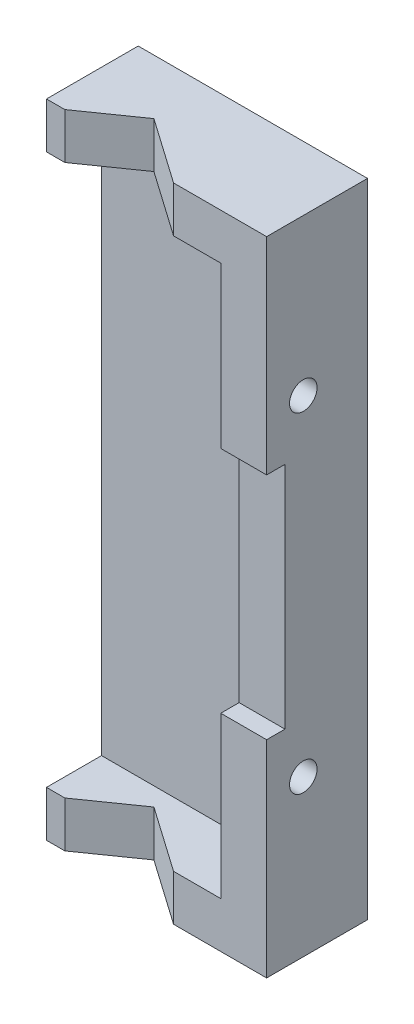
ISO-10303-21;
HEADER;
FILE_DESCRIPTION(('STEP AP214'),'2;1');
FILE_NAME('part.step','',(''),(''),'','','');
FILE_SCHEMA(('AUTOMOTIVE_DESIGN { 1 0 10303 214 1 1 1 1 }'));
ENDSEC;
DATA;
#1=APPLICATION_CONTEXT('core data for automotive mechanical design processes');
#2=APPLICATION_PROTOCOL_DEFINITION('international standard','automotive_design',2000,#1);
#3=PRODUCT_CONTEXT('',#1,'mechanical');
#4=PRODUCT('Part','Part','',(#3));
#5=PRODUCT_RELATED_PRODUCT_CATEGORY('part','',(#4));
#6=PRODUCT_DEFINITION_FORMATION('','',#4);
#7=PRODUCT_DEFINITION_CONTEXT('part definition',#1,'design');
#8=PRODUCT_DEFINITION('design','',#6,#7);
#9=PRODUCT_DEFINITION_SHAPE('','',#8);
#10=(LENGTH_UNIT() NAMED_UNIT(*) SI_UNIT(.MILLI.,.METRE.));
#11=(NAMED_UNIT(*) PLANE_ANGLE_UNIT() SI_UNIT($,.RADIAN.));
#12=(NAMED_UNIT(*) SI_UNIT($,.STERADIAN.) SOLID_ANGLE_UNIT());
#13=UNCERTAINTY_MEASURE_WITH_UNIT(LENGTH_MEASURE(1.E-05),#10,'distance_accuracy_value','');
#14=(GEOMETRIC_REPRESENTATION_CONTEXT(3) GLOBAL_UNCERTAINTY_ASSIGNED_CONTEXT((#13)) GLOBAL_UNIT_ASSIGNED_CONTEXT((#10,
#11,#12)) REPRESENTATION_CONTEXT('',''));
#15=CARTESIAN_POINT('',(0.,0.,0.));
#16=DIRECTION('',(0.,0.,1.));
#17=DIRECTION('',(1.,0.,0.));
#18=AXIS2_PLACEMENT_3D('',#15,#16,#17);
#19=CARTESIAN_POINT('',(2.3533320606791,30.,11.));
#20=DIRECTION('',(0.,0.,1.));
#21=DIRECTION('',(1.,0.,0.));
#22=AXIS2_PLACEMENT_3D('',#19,#20,#21);
#23=PLANE('',#22);
#24=DIRECTION('',(-1.,0.,0.));
#25=VECTOR('',#24,1.);
#26=CARTESIAN_POINT('',(12.501,-12.5,11.));
#27=LINE('',#26,#25);
#28=CARTESIAN_POINT('',(12.5,-12.5,11.));
#29=VERTEX_POINT('',#28);
#30=CARTESIAN_POINT('',(7.5,-12.5,11.));
#31=VERTEX_POINT('',#30);
#32=EDGE_CURVE('E165',#29,#31,#27,.T.);
#33=ORIENTED_EDGE('',*,*,#32,.T.);
#34=DIRECTION('',(0.,-1.,0.));
#35=VECTOR('',#34,1.);
#36=CARTESIAN_POINT('',(7.5,30.,11.));
#37=LINE('',#36,#35);
#38=CARTESIAN_POINT('',(7.5,-30.,11.));
#39=VERTEX_POINT('',#38);
#40=EDGE_CURVE('E418',#31,#39,#37,.T.);
#41=ORIENTED_EDGE('',*,*,#40,.T.);
#42=DIRECTION('',(-1.,0.,0.));
#43=VECTOR('',#42,1.);
#44=CARTESIAN_POINT('',(12.5,-30.,11.));
#45=LINE('',#44,#43);
#46=CARTESIAN_POINT('',(2.3533320606791,-30.,11.));
#47=VERTEX_POINT('',#46);
#48=EDGE_CURVE('E251',#39,#47,#45,.T.);
#49=ORIENTED_EDGE('',*,*,#48,.T.);
#50=DIRECTION('',(0.,-1.,0.));
#51=VECTOR('',#50,1.);
#52=CARTESIAN_POINT('',(2.3533320606791,-30.,11.));
#53=LINE('',#52,#51);
#54=CARTESIAN_POINT('',(2.3533320606791,-35.,11.));
#55=VERTEX_POINT('',#54);
#56=EDGE_CURVE('E232',#47,#55,#53,.T.);
#57=ORIENTED_EDGE('',*,*,#56,.T.);
#58=DIRECTION('',(-1.,0.,0.));
#59=VECTOR('',#58,1.);
#60=CARTESIAN_POINT('',(12.5,-35.,11.));
#61=LINE('',#60,#59);
#62=CARTESIAN_POINT('',(12.5,-35.,11.));
#63=VERTEX_POINT('',#62);
#64=EDGE_CURVE('E230',#63,#55,#61,.T.);
#65=ORIENTED_EDGE('',*,*,#64,.F.);
#66=DIRECTION('',(0.,1.,0.));
#67=VECTOR('',#66,1.);
#68=CARTESIAN_POINT('',(12.5,30.,11.));
#69=LINE('',#68,#67);
#70=EDGE_CURVE('E180',#63,#29,#69,.T.);
#71=ORIENTED_EDGE('',*,*,#70,.T.);
#72=EDGE_LOOP('',(#33,#41,#49,#57,#65,#71));
#73=FACE_BOUND('',#72,.T.);
#74=ADVANCED_FACE('F32',(#73),#23,.T.);
#75=CARTESIAN_POINT('',(0.,0.,4.));
#76=DIRECTION('',(0.,0.,-1.));
#77=DIRECTION('',(-1.,0.,0.));
#78=AXIS2_PLACEMENT_3D('',#75,#76,#77);
#79=PLANE('',#78);
#80=DIRECTION('',(0.,1.,0.));
#81=VECTOR('',#80,1.);
#82=CARTESIAN_POINT('',(7.5,30.,4.00000000000001));
#83=LINE('',#82,#81);
#84=CARTESIAN_POINT('',(7.5,-30.,4.));
#85=VERTEX_POINT('',#84);
#86=CARTESIAN_POINT('',(7.5,30.,4.00000000000001));
#87=VERTEX_POINT('',#86);
#88=EDGE_CURVE('E241',#85,#87,#83,.T.);
#89=ORIENTED_EDGE('',*,*,#88,.T.);
#90=DIRECTION('',(-1.,0.,0.));
#91=VECTOR('',#90,1.);
#92=CARTESIAN_POINT('',(-12.5,30.,4.));
#93=LINE('',#92,#91);
#94=CARTESIAN_POINT('',(-12.5,30.,4.));
#95=VERTEX_POINT('',#94);
#96=EDGE_CURVE('E267',#87,#95,#93,.T.);
#97=ORIENTED_EDGE('',*,*,#96,.T.);
#98=DIRECTION('',(0.,-1.,0.));
#99=VECTOR('',#98,1.);
#100=CARTESIAN_POINT('',(-12.5,-35.,4.));
#101=LINE('',#100,#99);
#102=CARTESIAN_POINT('',(-12.5,-30.,4.));
#103=VERTEX_POINT('',#102);
#104=EDGE_CURVE('E55',#95,#103,#101,.T.);
#105=ORIENTED_EDGE('',*,*,#104,.T.);
#106=DIRECTION('',(1.,0.,0.));
#107=VECTOR('',#106,1.);
#108=CARTESIAN_POINT('',(-12.5,-30.,4.));
#109=LINE('',#108,#107);
#110=EDGE_CURVE('E244',#103,#85,#109,.T.);
#111=ORIENTED_EDGE('',*,*,#110,.T.);
#112=EDGE_LOOP('',(#89,#97,#105,#111));
#113=FACE_BOUND('',#112,.T.);
#114=ADVANCED_FACE('F307',(#113),#79,.F.);
#115=CARTESIAN_POINT('',(0.,30.,0.));
#116=DIRECTION('',(0.,-1.,0.));
#117=DIRECTION('',(0.,0.,-1.));
#118=AXIS2_PLACEMENT_3D('',#115,#116,#117);
#119=PLANE('',#118);
#120=ORIENTED_EDGE('',*,*,#96,.F.);
#121=DIRECTION('',(0.,0.,1.));
#122=VECTOR('',#121,1.);
#123=CARTESIAN_POINT('',(7.5,30.,11.));
#124=LINE('',#123,#122);
#125=CARTESIAN_POINT('',(7.5,30.,11.));
#126=VERTEX_POINT('',#125);
#127=EDGE_CURVE('E236',#87,#126,#124,.T.);
#128=ORIENTED_EDGE('',*,*,#127,.T.);
#129=DIRECTION('',(1.,0.,0.));
#130=VECTOR('',#129,1.);
#131=CARTESIAN_POINT('',(2.3533320606791,30.,11.));
#132=LINE('',#131,#130);
#133=CARTESIAN_POINT('',(2.3533320606791,30.,11.));
#134=VERTEX_POINT('',#133);
#135=EDGE_CURVE('E264',#134,#126,#132,.T.);
#136=ORIENTED_EDGE('',*,*,#135,.F.);
#137=DIRECTION('',(0.819152044288995,0.,0.573576436351042));
#138=VECTOR('',#137,1.);
#139=CARTESIAN_POINT('',(-4.78740797303155,30.,6.));
#140=LINE('',#139,#138);
#141=CARTESIAN_POINT('',(-4.78740797303155,30.,6.));
#142=VERTEX_POINT('',#141);
#143=EDGE_CURVE('E261',#142,#134,#140,.T.);
#144=ORIENTED_EDGE('',*,*,#143,.F.);
#145=DIRECTION('',(0.819152044288991,0.,-0.573576436351047));
#146=VECTOR('',#145,1.);
#147=CARTESIAN_POINT('',(-4.78740797303155,30.,6.));
#148=LINE('',#147,#146);
#149=CARTESIAN_POINT('',(-10.5,30.,10.));
#150=VERTEX_POINT('',#149);
#151=EDGE_CURVE('E185',#150,#142,#148,.T.);
#152=ORIENTED_EDGE('',*,*,#151,.F.);
#153=DIRECTION('',(1.,0.,0.));
#154=VECTOR('',#153,1.);
#155=CARTESIAN_POINT('',(-10.5,30.,10.));
#156=LINE('',#155,#154);
#157=CARTESIAN_POINT('',(-12.5,30.,10.));
#158=VERTEX_POINT('',#157);
#159=EDGE_CURVE('E271',#158,#150,#156,.T.);
#160=ORIENTED_EDGE('',*,*,#159,.F.);
#161=DIRECTION('',(0.,0.,1.));
#162=VECTOR('',#161,1.);
#163=CARTESIAN_POINT('',(-12.5,30.,4.));
#164=LINE('',#163,#162);
#165=EDGE_CURVE('E269',#95,#158,#164,.T.);
#166=ORIENTED_EDGE('',*,*,#165,.F.);
#167=EDGE_LOOP('',(#120,#128,#136,#144,#152,#160,#166));
#168=FACE_BOUND('',#167,.T.);
#169=ADVANCED_FACE('F300',(#168),#119,.T.);
#170=CARTESIAN_POINT('',(0.,-30.,0.));
#171=DIRECTION('',(0.,-1.,0.));
#172=DIRECTION('',(0.,0.,-1.));
#173=AXIS2_PLACEMENT_3D('',#170,#171,#172);
#174=PLANE('',#173);
#175=DIRECTION('',(0.,0.,-1.));
#176=VECTOR('',#175,1.);
#177=CARTESIAN_POINT('',(7.5,-30.,11.));
#178=LINE('',#177,#176);
#179=EDGE_CURVE('E308',#39,#85,#178,.T.);
#180=ORIENTED_EDGE('',*,*,#179,.T.);
#181=ORIENTED_EDGE('',*,*,#110,.F.);
#182=DIRECTION('',(0.,0.,-1.));
#183=VECTOR('',#182,1.);
#184=CARTESIAN_POINT('',(-12.5,-30.,10.));
#185=LINE('',#184,#183);
#186=CARTESIAN_POINT('',(-12.5,-30.,10.));
#187=VERTEX_POINT('',#186);
#188=EDGE_CURVE('E322',#187,#103,#185,.T.);
#189=ORIENTED_EDGE('',*,*,#188,.F.);
#190=DIRECTION('',(-1.,0.,0.));
#191=VECTOR('',#190,1.);
#192=CARTESIAN_POINT('',(-10.5,-30.,10.));
#193=LINE('',#192,#191);
#194=CARTESIAN_POINT('',(-10.5,-30.,10.));
#195=VERTEX_POINT('',#194);
#196=EDGE_CURVE('E320',#195,#187,#193,.T.);
#197=ORIENTED_EDGE('',*,*,#196,.F.);
#198=DIRECTION('',(-0.819152044288991,0.,0.573576436351047));
#199=VECTOR('',#198,1.);
#200=CARTESIAN_POINT('',(-4.78740797303155,-30.,6.));
#201=LINE('',#200,#199);
#202=CARTESIAN_POINT('',(-4.78740797303155,-30.,6.));
#203=VERTEX_POINT('',#202);
#204=EDGE_CURVE('E317',#203,#195,#201,.T.);
#205=ORIENTED_EDGE('',*,*,#204,.F.);
#206=DIRECTION('',(-0.819152044288995,0.,-0.573576436351042));
#207=VECTOR('',#206,1.);
#208=CARTESIAN_POINT('',(2.3533320606791,-30.,11.));
#209=LINE('',#208,#207);
#210=EDGE_CURVE('E314',#47,#203,#209,.T.);
#211=ORIENTED_EDGE('',*,*,#210,.F.);
#212=ORIENTED_EDGE('',*,*,#48,.F.);
#213=EDGE_LOOP('',(#180,#181,#189,#197,#205,#211,#212));
#214=FACE_BOUND('',#213,.T.);
#215=ADVANCED_FACE('F327',(#214),#174,.F.);
#216=CARTESIAN_POINT('',(12.5,-35.,4.));
#217=DIRECTION('',(-1.,0.,0.));
#218=DIRECTION('',(0.,0.,1.));
#219=AXIS2_PLACEMENT_3D('',#216,#217,#218);
#220=PLANE('',#219);
#221=DIRECTION('',(0.,1.,0.));
#222=VECTOR('',#221,1.);
#223=CARTESIAN_POINT('',(12.5,12.5,9.));
#224=LINE('',#223,#222);
#225=CARTESIAN_POINT('',(12.5,-12.5,9.));
#226=VERTEX_POINT('',#225);
#227=CARTESIAN_POINT('',(12.5,12.5,9.));
#228=VERTEX_POINT('',#227);
#229=EDGE_CURVE('E398',#226,#228,#224,.T.);
#230=ORIENTED_EDGE('',*,*,#229,.F.);
#231=DIRECTION('',(0.,0.,-1.));
#232=VECTOR('',#231,1.);
#233=CARTESIAN_POINT('',(12.5,-12.5,11.));
#234=LINE('',#233,#232);
#235=EDGE_CURVE('E226',#29,#226,#234,.T.);
#236=ORIENTED_EDGE('',*,*,#235,.F.);
#237=ORIENTED_EDGE('',*,*,#70,.F.);
#238=DIRECTION('',(0.,0.,-1.));
#239=VECTOR('',#238,1.);
#240=CARTESIAN_POINT('',(12.5,-35.,4.));
#241=LINE('',#240,#239);
#242=CARTESIAN_POINT('',(12.5,-35.,0.));
#243=VERTEX_POINT('',#242);
#244=EDGE_CURVE('E191',#63,#243,#241,.T.);
#245=ORIENTED_EDGE('',*,*,#244,.T.);
#246=DIRECTION('',(0.,1.,0.));
#247=VECTOR('',#246,1.);
#248=CARTESIAN_POINT('',(12.5,-35.,0.));
#249=LINE('',#248,#247);
#250=CARTESIAN_POINT('',(12.5,35.,0.));
#251=VERTEX_POINT('',#250);
#252=EDGE_CURVE('E193',#243,#251,#249,.T.);
#253=ORIENTED_EDGE('',*,*,#252,.T.);
#254=DIRECTION('',(0.,0.,-1.));
#255=VECTOR('',#254,1.);
#256=CARTESIAN_POINT('',(12.5,35.,4.));
#257=LINE('',#256,#255);
#258=CARTESIAN_POINT('',(12.5,35.,11.));
#259=VERTEX_POINT('',#258);
#260=EDGE_CURVE('E11',#259,#251,#257,.T.);
#261=ORIENTED_EDGE('',*,*,#260,.F.);
#262=CARTESIAN_POINT('',(12.5,12.5,11.));
#263=VERTEX_POINT('',#262);
#264=EDGE_CURVE('E171',#263,#259,#69,.T.);
#265=ORIENTED_EDGE('',*,*,#264,.F.);
#266=DIRECTION('',(0.,0.,1.));
#267=VECTOR('',#266,1.);
#268=CARTESIAN_POINT('',(12.5,12.5,11.));
#269=LINE('',#268,#267);
#270=EDGE_CURVE('E157',#228,#263,#269,.T.);
#271=ORIENTED_EDGE('',*,*,#270,.F.);
#272=EDGE_LOOP('',(#230,#236,#237,#245,#253,#261,#265,#271));
#273=FACE_BOUND('',#272,.T.);
#274=CARTESIAN_POINT('',(12.5,-18.,7.));
#275=DIRECTION('',(1.,0.,0.));
#276=DIRECTION('',(0.,0.,-1.));
#277=AXIS2_PLACEMENT_3D('',#274,#275,#276);
#278=CIRCLE('',#277,1.5);
#279=CARTESIAN_POINT('',(12.5,-18.,5.5));
#280=VERTEX_POINT('',#279);
#281=EDGE_CURVE('E164',#280,#280,#278,.T.);
#282=ORIENTED_EDGE('',*,*,#281,.F.);
#283=EDGE_LOOP('',(#282));
#284=FACE_BOUND('',#283,.T.);
#285=CARTESIAN_POINT('',(12.5,18.,7.00000000000001));
#286=DIRECTION('',(1.,0.,0.));
#287=DIRECTION('',(0.,0.,-1.));
#288=AXIS2_PLACEMENT_3D('',#285,#286,#287);
#289=CIRCLE('',#288,1.5);
#290=CARTESIAN_POINT('',(12.5,18.,5.5));
#291=VERTEX_POINT('',#290);
#292=EDGE_CURVE('E412',#291,#291,#289,.T.);
#293=ORIENTED_EDGE('',*,*,#292,.F.);
#294=EDGE_LOOP('',(#293));
#295=FACE_BOUND('',#294,.T.);
#296=ADVANCED_FACE('F34',(#273,#284,#295),#220,.F.);
#297=CARTESIAN_POINT('',(-12.5,35.,4.));
#298=DIRECTION('',(0.,-1.,0.));
#299=DIRECTION('',(0.,0.,-1.));
#300=AXIS2_PLACEMENT_3D('',#297,#298,#299);
#301=PLANE('',#300);
#302=DIRECTION('',(-1.,0.,0.));
#303=VECTOR('',#302,1.);
#304=CARTESIAN_POINT('',(-12.5,35.,0.));
#305=LINE('',#304,#303);
#306=CARTESIAN_POINT('',(-12.5,35.,0.));
#307=VERTEX_POINT('',#306);
#308=EDGE_CURVE('E195',#251,#307,#305,.T.);
#309=ORIENTED_EDGE('',*,*,#308,.T.);
#310=DIRECTION('',(0.,0.,-1.));
#311=VECTOR('',#310,1.);
#312=CARTESIAN_POINT('',(-12.5,35.,4.));
#313=LINE('',#312,#311);
#314=CARTESIAN_POINT('',(-12.5,35.,10.));
#315=VERTEX_POINT('',#314);
#316=EDGE_CURVE('E40',#315,#307,#313,.T.);
#317=ORIENTED_EDGE('',*,*,#316,.F.);
#318=DIRECTION('',(1.,0.,0.));
#319=VECTOR('',#318,1.);
#320=CARTESIAN_POINT('',(-10.5,35.,10.));
#321=LINE('',#320,#319);
#322=CARTESIAN_POINT('',(-10.5,35.,10.));
#323=VERTEX_POINT('',#322);
#324=EDGE_CURVE('E280',#315,#323,#321,.T.);
#325=ORIENTED_EDGE('',*,*,#324,.T.);
#326=DIRECTION('',(0.819152044288991,0.,-0.573576436351047));
#327=VECTOR('',#326,1.);
#328=CARTESIAN_POINT('',(-4.78740797303155,35.,6.));
#329=LINE('',#328,#327);
#330=CARTESIAN_POINT('',(-4.78740797303155,35.,6.));
#331=VERTEX_POINT('',#330);
#332=EDGE_CURVE('E265',#323,#331,#329,.T.);
#333=ORIENTED_EDGE('',*,*,#332,.T.);
#334=DIRECTION('',(0.819152044288995,0.,0.573576436351042));
#335=VECTOR('',#334,1.);
#336=CARTESIAN_POINT('',(-4.78740797303155,35.,6.));
#337=LINE('',#336,#335);
#338=CARTESIAN_POINT('',(2.3533320606791,35.,11.));
#339=VERTEX_POINT('',#338);
#340=EDGE_CURVE('E255',#331,#339,#337,.T.);
#341=ORIENTED_EDGE('',*,*,#340,.T.);
#342=DIRECTION('',(1.,0.,0.));
#343=VECTOR('',#342,1.);
#344=CARTESIAN_POINT('',(2.3533320606791,35.,11.));
#345=LINE('',#344,#343);
#346=EDGE_CURVE('E278',#339,#259,#345,.T.);
#347=ORIENTED_EDGE('',*,*,#346,.T.);
#348=ORIENTED_EDGE('',*,*,#260,.T.);
#349=EDGE_LOOP('',(#309,#317,#325,#333,#341,#347,#348));
#350=FACE_BOUND('',#349,.T.);
#351=ADVANCED_FACE('F291',(#350),#301,.F.);
#352=CARTESIAN_POINT('',(-12.5,-35.,4.));
#353=DIRECTION('',(1.,0.,0.));
#354=DIRECTION('',(0.,0.,-1.));
#355=AXIS2_PLACEMENT_3D('',#352,#353,#354);
#356=PLANE('',#355);
#357=DIRECTION('',(0.,-1.,0.));
#358=VECTOR('',#357,1.);
#359=CARTESIAN_POINT('',(-12.5,-35.,0.));
#360=LINE('',#359,#358);
#361=CARTESIAN_POINT('',(-12.5,-35.,0.));
#362=VERTEX_POINT('',#361);
#363=EDGE_CURVE('E198',#307,#362,#360,.T.);
#364=ORIENTED_EDGE('',*,*,#363,.T.);
#365=DIRECTION('',(0.,0.,-1.));
#366=VECTOR('',#365,1.);
#367=CARTESIAN_POINT('',(-12.5,-35.,4.));
#368=LINE('',#367,#366);
#369=CARTESIAN_POINT('',(-12.5,-35.,10.));
#370=VERTEX_POINT('',#369);
#371=EDGE_CURVE('E203',#370,#362,#368,.T.);
#372=ORIENTED_EDGE('',*,*,#371,.F.);
#373=DIRECTION('',(0.,-1.,0.));
#374=VECTOR('',#373,1.);
#375=CARTESIAN_POINT('',(-12.5,-30.,10.));
#376=LINE('',#375,#374);
#377=EDGE_CURVE('E252',#187,#370,#376,.T.);
#378=ORIENTED_EDGE('',*,*,#377,.F.);
#379=ORIENTED_EDGE('',*,*,#188,.T.);
#380=ORIENTED_EDGE('',*,*,#104,.F.);
#381=ORIENTED_EDGE('',*,*,#165,.T.);
#382=DIRECTION('',(0.,1.,0.));
#383=VECTOR('',#382,1.);
#384=CARTESIAN_POINT('',(-12.5,30.,10.));
#385=LINE('',#384,#383);
#386=EDGE_CURVE('E184',#158,#315,#385,.T.);
#387=ORIENTED_EDGE('',*,*,#386,.T.);
#388=ORIENTED_EDGE('',*,*,#316,.T.);
#389=EDGE_LOOP('',(#364,#372,#378,#379,#380,#381,#387,#388));
#390=FACE_BOUND('',#389,.T.);
#391=ADVANCED_FACE('F209',(#390),#356,.F.);
#392=CARTESIAN_POINT('',(-12.5,-35.,4.));
#393=DIRECTION('',(0.,1.,0.));
#394=DIRECTION('',(0.,0.,1.));
#395=AXIS2_PLACEMENT_3D('',#392,#393,#394);
#396=PLANE('',#395);
#397=DIRECTION('',(1.,0.,0.));
#398=VECTOR('',#397,1.);
#399=CARTESIAN_POINT('',(-12.5,-35.,0.));
#400=LINE('',#399,#398);
#401=EDGE_CURVE('E192',#362,#243,#400,.T.);
#402=ORIENTED_EDGE('',*,*,#401,.T.);
#403=ORIENTED_EDGE('',*,*,#244,.F.);
#404=ORIENTED_EDGE('',*,*,#64,.T.);
#405=DIRECTION('',(-0.819152044288995,0.,-0.573576436351042));
#406=VECTOR('',#405,1.);
#407=CARTESIAN_POINT('',(2.3533320606791,-35.,11.));
#408=LINE('',#407,#406);
#409=CARTESIAN_POINT('',(-4.78740797303155,-35.,6.));
#410=VERTEX_POINT('',#409);
#411=EDGE_CURVE('E235',#55,#410,#408,.T.);
#412=ORIENTED_EDGE('',*,*,#411,.T.);
#413=DIRECTION('',(-0.819152044288991,0.,0.573576436351047));
#414=VECTOR('',#413,1.);
#415=CARTESIAN_POINT('',(-4.78740797303155,-35.,6.));
#416=LINE('',#415,#414);
#417=CARTESIAN_POINT('',(-10.5,-35.,10.));
#418=VERTEX_POINT('',#417);
#419=EDGE_CURVE('E238',#410,#418,#416,.T.);
#420=ORIENTED_EDGE('',*,*,#419,.T.);
#421=DIRECTION('',(-1.,0.,0.));
#422=VECTOR('',#421,1.);
#423=CARTESIAN_POINT('',(-10.5,-35.,10.));
#424=LINE('',#423,#422);
#425=EDGE_CURVE('E249',#418,#370,#424,.T.);
#426=ORIENTED_EDGE('',*,*,#425,.T.);
#427=ORIENTED_EDGE('',*,*,#371,.T.);
#428=EDGE_LOOP('',(#402,#403,#404,#412,#420,#426,#427));
#429=FACE_BOUND('',#428,.T.);
#430=ADVANCED_FACE('F220',(#429),#396,.F.);
#431=CARTESIAN_POINT('',(0.,0.,0.));
#432=DIRECTION('',(0.,0.,-1.));
#433=DIRECTION('',(-1.,0.,0.));
#434=AXIS2_PLACEMENT_3D('',#431,#432,#433);
#435=PLANE('',#434);
#436=ORIENTED_EDGE('',*,*,#252,.F.);
#437=ORIENTED_EDGE('',*,*,#401,.F.);
#438=ORIENTED_EDGE('',*,*,#363,.F.);
#439=ORIENTED_EDGE('',*,*,#308,.F.);
#440=EDGE_LOOP('',(#436,#437,#438,#439));
#441=FACE_BOUND('',#440,.T.);
#442=ADVANCED_FACE('F217',(#441),#435,.T.);
#443=CARTESIAN_POINT('',(-4.78740797303155,30.,6.));
#444=DIRECTION('',(-0.573576436351042,0.,0.819152044288995));
#445=DIRECTION('',(0.819152044288995,0.,0.573576436351042));
#446=AXIS2_PLACEMENT_3D('',#443,#444,#445);
#447=PLANE('',#446);
#448=ORIENTED_EDGE('',*,*,#340,.F.);
#449=DIRECTION('',(0.,1.,0.));
#450=VECTOR('',#449,1.);
#451=CARTESIAN_POINT('',(-4.78740797303155,30.,6.));
#452=LINE('',#451,#450);
#453=EDGE_CURVE('E196',#142,#331,#452,.T.);
#454=ORIENTED_EDGE('',*,*,#453,.F.);
#455=ORIENTED_EDGE('',*,*,#143,.T.);
#456=DIRECTION('',(0.,1.,0.));
#457=VECTOR('',#456,1.);
#458=CARTESIAN_POINT('',(2.3533320606791,30.,11.));
#459=LINE('',#458,#457);
#460=EDGE_CURVE('E181',#134,#339,#459,.T.);
#461=ORIENTED_EDGE('',*,*,#460,.T.);
#462=EDGE_LOOP('',(#448,#454,#455,#461));
#463=FACE_BOUND('',#462,.T.);
#464=ADVANCED_FACE('F296',(#463),#447,.T.);
#465=CARTESIAN_POINT('',(-4.78740797303155,30.,6.));
#466=DIRECTION('',(0.573576436351047,0.,0.819152044288991));
#467=DIRECTION('',(0.819152044288991,0.,-0.573576436351047));
#468=AXIS2_PLACEMENT_3D('',#465,#466,#467);
#469=PLANE('',#468);
#470=ORIENTED_EDGE('',*,*,#332,.F.);
#471=DIRECTION('',(0.,1.,0.));
#472=VECTOR('',#471,1.);
#473=CARTESIAN_POINT('',(-10.5,30.,10.));
#474=LINE('',#473,#472);
#475=EDGE_CURVE('E284',#150,#323,#474,.T.);
#476=ORIENTED_EDGE('',*,*,#475,.F.);
#477=ORIENTED_EDGE('',*,*,#151,.T.);
#478=ORIENTED_EDGE('',*,*,#453,.T.);
#479=EDGE_LOOP('',(#470,#476,#477,#478));
#480=FACE_BOUND('',#479,.T.);
#481=ADVANCED_FACE('F292',(#480),#469,.T.);
#482=CARTESIAN_POINT('',(-10.5,30.,10.));
#483=DIRECTION('',(0.,0.,1.));
#484=DIRECTION('',(1.,0.,0.));
#485=AXIS2_PLACEMENT_3D('',#482,#483,#484);
#486=PLANE('',#485);
#487=ORIENTED_EDGE('',*,*,#324,.F.);
#488=ORIENTED_EDGE('',*,*,#386,.F.);
#489=ORIENTED_EDGE('',*,*,#159,.T.);
#490=ORIENTED_EDGE('',*,*,#475,.T.);
#491=EDGE_LOOP('',(#487,#488,#489,#490));
#492=FACE_BOUND('',#491,.T.);
#493=ADVANCED_FACE('F286',(#492),#486,.T.);
#494=DIRECTION('',(-1.,0.,0.));
#495=VECTOR('',#494,1.);
#496=CARTESIAN_POINT('',(12.501,12.5,11.));
#497=LINE('',#496,#495);
#498=CARTESIAN_POINT('',(7.5,12.5,11.));
#499=VERTEX_POINT('',#498);
#500=EDGE_CURVE('E47',#263,#499,#497,.T.);
#501=ORIENTED_EDGE('',*,*,#500,.F.);
#502=ORIENTED_EDGE('',*,*,#264,.T.);
#503=ORIENTED_EDGE('',*,*,#346,.F.);
#504=ORIENTED_EDGE('',*,*,#460,.F.);
#505=ORIENTED_EDGE('',*,*,#135,.T.);
#506=EDGE_CURVE('E174',#126,#499,#37,.T.);
#507=ORIENTED_EDGE('',*,*,#506,.T.);
#508=EDGE_LOOP('',(#501,#502,#503,#504,#505,#507));
#509=FACE_BOUND('',#508,.T.);
#510=ADVANCED_FACE('F169',(#509),#23,.T.);
#511=CARTESIAN_POINT('',(-10.5,-30.,10.));
#512=DIRECTION('',(0.,0.,1.));
#513=DIRECTION('',(1.,0.,0.));
#514=AXIS2_PLACEMENT_3D('',#511,#512,#513);
#515=PLANE('',#514);
#516=ORIENTED_EDGE('',*,*,#425,.F.);
#517=DIRECTION('',(0.,-1.,0.));
#518=VECTOR('',#517,1.);
#519=CARTESIAN_POINT('',(-10.5,-30.,10.));
#520=LINE('',#519,#518);
#521=EDGE_CURVE('E256',#195,#418,#520,.T.);
#522=ORIENTED_EDGE('',*,*,#521,.F.);
#523=ORIENTED_EDGE('',*,*,#196,.T.);
#524=ORIENTED_EDGE('',*,*,#377,.T.);
#525=EDGE_LOOP('',(#516,#522,#523,#524));
#526=FACE_BOUND('',#525,.T.);
#527=ADVANCED_FACE('F331',(#526),#515,.T.);
#528=CARTESIAN_POINT('',(-4.78740797303155,-30.,6.));
#529=DIRECTION('',(0.573576436351047,0.,0.819152044288991));
#530=DIRECTION('',(0.819152044288991,0.,-0.573576436351047));
#531=AXIS2_PLACEMENT_3D('',#528,#529,#530);
#532=PLANE('',#531);
#533=ORIENTED_EDGE('',*,*,#419,.F.);
#534=DIRECTION('',(0.,-1.,0.));
#535=VECTOR('',#534,1.);
#536=CARTESIAN_POINT('',(-4.78740797303155,-30.,6.));
#537=LINE('',#536,#535);
#538=EDGE_CURVE('E258',#203,#410,#537,.T.);
#539=ORIENTED_EDGE('',*,*,#538,.F.);
#540=ORIENTED_EDGE('',*,*,#204,.T.);
#541=ORIENTED_EDGE('',*,*,#521,.T.);
#542=EDGE_LOOP('',(#533,#539,#540,#541));
#543=FACE_BOUND('',#542,.T.);
#544=ADVANCED_FACE('F334',(#543),#532,.T.);
#545=CARTESIAN_POINT('',(2.3533320606791,-30.,11.));
#546=DIRECTION('',(-0.573576436351042,0.,0.819152044288995));
#547=DIRECTION('',(0.819152044288995,0.,0.573576436351042));
#548=AXIS2_PLACEMENT_3D('',#545,#546,#547);
#549=PLANE('',#548);
#550=ORIENTED_EDGE('',*,*,#411,.F.);
#551=ORIENTED_EDGE('',*,*,#56,.F.);
#552=ORIENTED_EDGE('',*,*,#210,.T.);
#553=ORIENTED_EDGE('',*,*,#538,.T.);
#554=EDGE_LOOP('',(#550,#551,#552,#553));
#555=FACE_BOUND('',#554,.T.);
#556=ADVANCED_FACE('F338',(#555),#549,.T.);
#557=CARTESIAN_POINT('',(7.5,0.,0.));
#558=DIRECTION('',(1.,0.,0.));
#559=DIRECTION('',(0.,0.,-1.));
#560=AXIS2_PLACEMENT_3D('',#557,#558,#559);
#561=PLANE('',#560);
#562=CARTESIAN_POINT('',(7.5,-18.,7.));
#563=DIRECTION('',(1.,0.,0.));
#564=DIRECTION('',(0.,0.,-1.));
#565=AXIS2_PLACEMENT_3D('',#562,#563,#564);
#566=CIRCLE('',#565,1.5);
#567=CARTESIAN_POINT('',(7.5,-18.,5.5));
#568=VERTEX_POINT('',#567);
#569=EDGE_CURVE('E409',#568,#568,#566,.T.);
#570=ORIENTED_EDGE('',*,*,#569,.T.);
#571=EDGE_LOOP('',(#570));
#572=FACE_BOUND('',#571,.T.);
#573=CARTESIAN_POINT('',(7.5,18.,7.00000000000001));
#574=DIRECTION('',(1.,0.,0.));
#575=DIRECTION('',(0.,0.,-1.));
#576=AXIS2_PLACEMENT_3D('',#573,#574,#575);
#577=CIRCLE('',#576,1.5);
#578=CARTESIAN_POINT('',(7.5,18.,5.5));
#579=VERTEX_POINT('',#578);
#580=EDGE_CURVE('E415',#579,#579,#577,.T.);
#581=ORIENTED_EDGE('',*,*,#580,.T.);
#582=EDGE_LOOP('',(#581));
#583=FACE_BOUND('',#582,.T.);
#584=ORIENTED_EDGE('',*,*,#40,.F.);
#585=DIRECTION('',(0.,0.,1.));
#586=VECTOR('',#585,1.);
#587=CARTESIAN_POINT('',(7.5,-12.5,11.));
#588=LINE('',#587,#586);
#589=CARTESIAN_POINT('',(7.5,-12.5,9.));
#590=VERTEX_POINT('',#589);
#591=EDGE_CURVE('E175',#590,#31,#588,.T.);
#592=ORIENTED_EDGE('',*,*,#591,.F.);
#593=DIRECTION('',(0.,-1.,0.));
#594=VECTOR('',#593,1.);
#595=CARTESIAN_POINT('',(7.5,12.5,9.));
#596=LINE('',#595,#594);
#597=CARTESIAN_POINT('',(7.5,12.5,9.));
#598=VERTEX_POINT('',#597);
#599=EDGE_CURVE('E403',#598,#590,#596,.T.);
#600=ORIENTED_EDGE('',*,*,#599,.F.);
#601=DIRECTION('',(0.,0.,-1.));
#602=VECTOR('',#601,1.);
#603=CARTESIAN_POINT('',(7.5,12.5,11.));
#604=LINE('',#603,#602);
#605=EDGE_CURVE('E397',#499,#598,#604,.T.);
#606=ORIENTED_EDGE('',*,*,#605,.F.);
#607=ORIENTED_EDGE('',*,*,#506,.F.);
#608=ORIENTED_EDGE('',*,*,#127,.F.);
#609=ORIENTED_EDGE('',*,*,#88,.F.);
#610=ORIENTED_EDGE('',*,*,#179,.F.);
#611=EDGE_LOOP('',(#584,#592,#600,#606,#607,#608,#609,#610));
#612=FACE_BOUND('',#611,.T.);
#613=ADVANCED_FACE('F304',(#572,#583,#612),#561,.F.);
#614=CARTESIAN_POINT('',(7.5,18.,7.00000000000001));
#615=DIRECTION('',(1.,0.,0.));
#616=DIRECTION('',(0.,0.,-1.));
#617=AXIS2_PLACEMENT_3D('',#614,#615,#616);
#618=CYLINDRICAL_SURFACE('',#617,1.5);
#619=ORIENTED_EDGE('',*,*,#580,.F.);
#620=EDGE_LOOP('',(#619));
#621=FACE_BOUND('',#620,.T.);
#622=ORIENTED_EDGE('',*,*,#292,.T.);
#623=EDGE_LOOP('',(#622));
#624=FACE_BOUND('',#623,.T.);
#625=ADVANCED_FACE('F345',(#621,#624),#618,.F.);
#626=CARTESIAN_POINT('',(7.5,-18.,7.));
#627=DIRECTION('',(1.,0.,0.));
#628=DIRECTION('',(0.,0.,-1.));
#629=AXIS2_PLACEMENT_3D('',#626,#627,#628);
#630=CYLINDRICAL_SURFACE('',#629,1.5);
#631=ORIENTED_EDGE('',*,*,#569,.F.);
#632=EDGE_LOOP('',(#631));
#633=FACE_BOUND('',#632,.T.);
#634=ORIENTED_EDGE('',*,*,#281,.T.);
#635=EDGE_LOOP('',(#634));
#636=FACE_BOUND('',#635,.T.);
#637=ADVANCED_FACE('F379',(#633,#636),#630,.F.);
#638=CARTESIAN_POINT('',(12.501,-12.5,11.));
#639=DIRECTION('',(0.,-1.,0.));
#640=DIRECTION('',(0.,0.,-1.));
#641=AXIS2_PLACEMENT_3D('',#638,#639,#640);
#642=PLANE('',#641);
#643=ORIENTED_EDGE('',*,*,#235,.T.);
#644=DIRECTION('',(-1.,0.,0.));
#645=VECTOR('',#644,1.);
#646=CARTESIAN_POINT('',(12.501,-12.5,9.));
#647=LINE('',#646,#645);
#648=EDGE_CURVE('E395',#226,#590,#647,.T.);
#649=ORIENTED_EDGE('',*,*,#648,.T.);
#650=ORIENTED_EDGE('',*,*,#591,.T.);
#651=ORIENTED_EDGE('',*,*,#32,.F.);
#652=EDGE_LOOP('',(#643,#649,#650,#651));
#653=FACE_BOUND('',#652,.T.);
#654=ADVANCED_FACE('F383',(#653),#642,.F.);
#655=CARTESIAN_POINT('',(12.501,12.5,9.));
#656=DIRECTION('',(0.,0.,-1.));
#657=DIRECTION('',(0.,1.,0.));
#658=AXIS2_PLACEMENT_3D('',#655,#656,#657);
#659=PLANE('',#658);
#660=ORIENTED_EDGE('',*,*,#229,.T.);
#661=DIRECTION('',(-1.,0.,0.));
#662=VECTOR('',#661,1.);
#663=CARTESIAN_POINT('',(12.501,12.5,9.));
#664=LINE('',#663,#662);
#665=EDGE_CURVE('E159',#228,#598,#664,.T.);
#666=ORIENTED_EDGE('',*,*,#665,.T.);
#667=ORIENTED_EDGE('',*,*,#599,.T.);
#668=ORIENTED_EDGE('',*,*,#648,.F.);
#669=EDGE_LOOP('',(#660,#666,#667,#668));
#670=FACE_BOUND('',#669,.T.);
#671=ADVANCED_FACE('F387',(#670),#659,.F.);
#672=CARTESIAN_POINT('',(12.501,12.5,11.));
#673=DIRECTION('',(0.,1.,0.));
#674=DIRECTION('',(0.,0.,1.));
#675=AXIS2_PLACEMENT_3D('',#672,#673,#674);
#676=PLANE('',#675);
#677=ORIENTED_EDGE('',*,*,#270,.T.);
#678=ORIENTED_EDGE('',*,*,#500,.T.);
#679=ORIENTED_EDGE('',*,*,#605,.T.);
#680=ORIENTED_EDGE('',*,*,#665,.F.);
#681=EDGE_LOOP('',(#677,#678,#679,#680));
#682=FACE_BOUND('',#681,.T.);
#683=ADVANCED_FACE('F158',(#682),#676,.F.);
#684=CLOSED_SHELL('',(#74,#114,#169,#215,#296,#351,#391,#430,#442,#464,#481,#493,#510,#527,#544,
#556,#613,#625,#637,#654,#671,#683));
#685=MANIFOLD_SOLID_BREP('B2',#684);
#686=ADVANCED_BREP_SHAPE_REPRESENTATION('',(#18,#685),#14);
#687=SHAPE_DEFINITION_REPRESENTATION(#9,#686);
ENDSEC;
END-ISO-10303-21;
